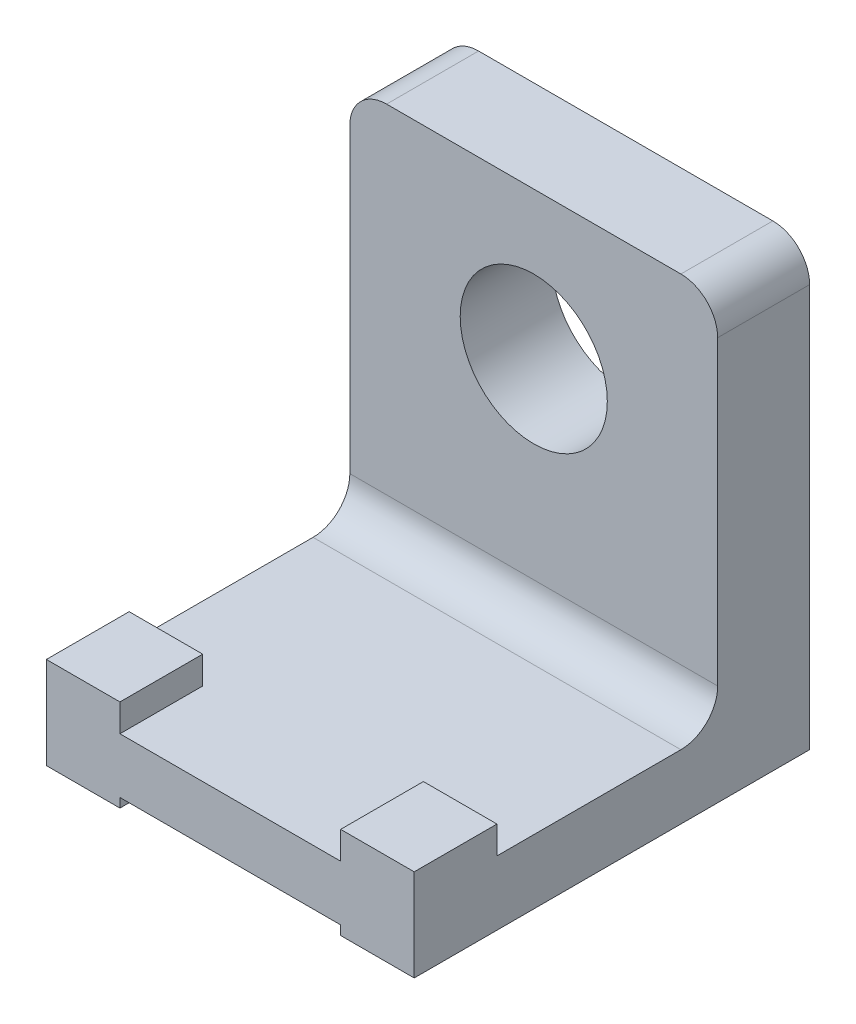
ISO-10303-21;
HEADER;
FILE_DESCRIPTION(('STEP AP214'),'2;1');
FILE_NAME('part.step','',(''),(''),'','','');
FILE_SCHEMA(('AUTOMOTIVE_DESIGN { 1 0 10303 214 1 1 1 1 }'));
ENDSEC;
DATA;
#1=APPLICATION_CONTEXT('core data for automotive mechanical design processes');
#2=APPLICATION_PROTOCOL_DEFINITION('international standard','automotive_design',2000,#1);
#3=PRODUCT_CONTEXT('',#1,'mechanical');
#4=PRODUCT('Part','Part','',(#3));
#5=PRODUCT_RELATED_PRODUCT_CATEGORY('part','',(#4));
#6=PRODUCT_DEFINITION_FORMATION('','',#4);
#7=PRODUCT_DEFINITION_CONTEXT('part definition',#1,'design');
#8=PRODUCT_DEFINITION('design','',#6,#7);
#9=PRODUCT_DEFINITION_SHAPE('','',#8);
#10=(LENGTH_UNIT() NAMED_UNIT(*) SI_UNIT(.MILLI.,.METRE.));
#11=(NAMED_UNIT(*) PLANE_ANGLE_UNIT() SI_UNIT($,.RADIAN.));
#12=(NAMED_UNIT(*) SI_UNIT($,.STERADIAN.) SOLID_ANGLE_UNIT());
#13=UNCERTAINTY_MEASURE_WITH_UNIT(LENGTH_MEASURE(1.E-05),#10,'distance_accuracy_value','');
#14=(GEOMETRIC_REPRESENTATION_CONTEXT(3) GLOBAL_UNCERTAINTY_ASSIGNED_CONTEXT((#13)) GLOBAL_UNIT_ASSIGNED_CONTEXT((#10,
#11,#12)) REPRESENTATION_CONTEXT('',''));
#15=CARTESIAN_POINT('',(0.,0.,0.));
#16=DIRECTION('',(0.,0.,1.));
#17=DIRECTION('',(1.,0.,0.));
#18=AXIS2_PLACEMENT_3D('',#15,#16,#17);
#19=CARTESIAN_POINT('',(-127.,0.,0.));
#20=DIRECTION('',(0.,-1.,0.));
#21=DIRECTION('',(0.,0.,-1.));
#22=AXIS2_PLACEMENT_3D('',#19,#20,#21);
#23=PLANE('',#22);
#24=DIRECTION('',(0.,0.,1.));
#25=VECTOR('',#24,1.);
#26=CARTESIAN_POINT('',(-25.4,0.,-184.216117149098));
#27=LINE('',#26,#25);
#28=CARTESIAN_POINT('',(-25.4,0.,-107.95));
#29=VERTEX_POINT('',#28);
#30=CARTESIAN_POINT('',(-25.4,0.,28.575));
#31=VERTEX_POINT('',#30);
#32=EDGE_CURVE('E207',#29,#31,#27,.T.);
#33=ORIENTED_EDGE('',*,*,#32,.F.);
#34=DIRECTION('',(1.,0.,0.));
#35=VECTOR('',#34,1.);
#36=CARTESIAN_POINT('',(-127.,0.,-107.95));
#37=LINE('',#36,#35);
#38=CARTESIAN_POINT('',(0.,0.,-107.95));
#39=VERTEX_POINT('',#38);
#40=EDGE_CURVE('E195',#29,#39,#37,.T.);
#41=ORIENTED_EDGE('',*,*,#40,.T.);
#42=DIRECTION('',(0.,0.,-1.));
#43=VECTOR('',#42,1.);
#44=CARTESIAN_POINT('',(0.,0.,0.));
#45=LINE('',#44,#43);
#46=CARTESIAN_POINT('',(0.,0.,28.575));
#47=VERTEX_POINT('',#46);
#48=EDGE_CURVE('E314',#47,#39,#45,.T.);
#49=ORIENTED_EDGE('',*,*,#48,.F.);
#50=DIRECTION('',(1.,0.,0.));
#51=VECTOR('',#50,1.);
#52=CARTESIAN_POINT('',(-127.,0.,28.575));
#53=LINE('',#52,#51);
#54=EDGE_CURVE('E252',#31,#47,#53,.T.);
#55=ORIENTED_EDGE('',*,*,#54,.F.);
#56=EDGE_LOOP('',(#33,#41,#49,#55));
#57=FACE_BOUND('',#56,.T.);
#58=ADVANCED_FACE('F37',(#57),#23,.T.);
#59=CARTESIAN_POINT('',(-127.,34.925,-63.5));
#60=DIRECTION('',(1.,0.,0.));
#61=DIRECTION('',(0.,0.,-1.));
#62=AXIS2_PLACEMENT_3D('',#59,#60,#61);
#63=CYLINDRICAL_SURFACE('',#62,12.7);
#64=CARTESIAN_POINT('',(0.,34.925,-63.5));
#65=DIRECTION('',(-1.,0.,0.));
#66=DIRECTION('',(0.,0.,1.));
#67=AXIS2_PLACEMENT_3D('',#64,#65,#66);
#68=CIRCLE('',#67,12.7);
#69=CARTESIAN_POINT('',(0.,34.925,-76.2));
#70=VERTEX_POINT('',#69);
#71=CARTESIAN_POINT('',(0.,22.225,-63.5));
#72=VERTEX_POINT('',#71);
#73=EDGE_CURVE('E296',#70,#72,#68,.T.);
#74=ORIENTED_EDGE('',*,*,#73,.F.);
#75=DIRECTION('',(1.,0.,0.));
#76=VECTOR('',#75,1.);
#77=CARTESIAN_POINT('',(-127.,34.925,-76.2));
#78=LINE('',#77,#76);
#79=CARTESIAN_POINT('',(-127.,34.925,-76.2));
#80=VERTEX_POINT('',#79);
#81=EDGE_CURVE('E11',#80,#70,#78,.T.);
#82=ORIENTED_EDGE('',*,*,#81,.F.);
#83=CARTESIAN_POINT('',(-127.,34.925,-63.5));
#84=DIRECTION('',(-1.,0.,0.));
#85=DIRECTION('',(0.,0.,1.));
#86=AXIS2_PLACEMENT_3D('',#83,#84,#85);
#87=CIRCLE('',#86,12.7);
#88=CARTESIAN_POINT('',(-127.,22.225,-63.5));
#89=VERTEX_POINT('',#88);
#90=EDGE_CURVE('E297',#80,#89,#87,.T.);
#91=ORIENTED_EDGE('',*,*,#90,.T.);
#92=DIRECTION('',(1.,0.,0.));
#93=VECTOR('',#92,1.);
#94=CARTESIAN_POINT('',(-127.,22.225,-63.5));
#95=LINE('',#94,#93);
#96=EDGE_CURVE('E41',#89,#72,#95,.T.);
#97=ORIENTED_EDGE('',*,*,#96,.T.);
#98=EDGE_LOOP('',(#74,#82,#91,#97));
#99=FACE_BOUND('',#98,.T.);
#100=ADVANCED_FACE('F39',(#99),#63,.F.);
#101=CARTESIAN_POINT('',(-127.,75.565,-76.2));
#102=DIRECTION('',(0.,0.,1.));
#103=DIRECTION('',(0.,-1.,0.));
#104=AXIS2_PLACEMENT_3D('',#101,#102,#103);
#105=PLANE('',#104);
#106=CARTESIAN_POINT('',(-63.5,100.965,-76.2));
#107=DIRECTION('',(0.,0.,1.));
#108=DIRECTION('',(0.,-1.,0.));
#109=AXIS2_PLACEMENT_3D('',#106,#107,#108);
#110=CIRCLE('',#109,25.4);
#111=CARTESIAN_POINT('',(-63.5,75.565,-76.2));
#112=VERTEX_POINT('',#111);
#113=EDGE_CURVE('E213',#112,#112,#110,.F.);
#114=ORIENTED_EDGE('',*,*,#113,.T.);
#115=EDGE_LOOP('',(#114));
#116=FACE_BOUND('',#115,.T.);
#117=DIRECTION('',(0.,-1.,0.));
#118=VECTOR('',#117,1.);
#119=CARTESIAN_POINT('',(0.,75.565,-76.2));
#120=LINE('',#119,#118);
#121=CARTESIAN_POINT('',(0.,139.065,-76.2));
#122=VERTEX_POINT('',#121);
#123=EDGE_CURVE('E300',#122,#70,#120,.T.);
#124=ORIENTED_EDGE('',*,*,#123,.F.);
#125=CARTESIAN_POINT('',(-12.7,139.065,-76.2));
#126=DIRECTION('',(0.,0.,1.));
#127=DIRECTION('',(0.,-1.,0.));
#128=AXIS2_PLACEMENT_3D('',#125,#126,#127);
#129=CIRCLE('',#128,12.7);
#130=CARTESIAN_POINT('',(-12.7000000000001,151.765,-76.2));
#131=VERTEX_POINT('',#130);
#132=EDGE_CURVE('E236',#122,#131,#129,.T.);
#133=ORIENTED_EDGE('',*,*,#132,.T.);
#134=DIRECTION('',(-1.,0.,0.));
#135=VECTOR('',#134,1.);
#136=CARTESIAN_POINT('',(-12.7000000000001,151.765,-76.2));
#137=LINE('',#136,#135);
#138=CARTESIAN_POINT('',(-114.3,151.765,-76.2));
#139=VERTEX_POINT('',#138);
#140=EDGE_CURVE('E233',#131,#139,#137,.T.);
#141=ORIENTED_EDGE('',*,*,#140,.T.);
#142=CARTESIAN_POINT('',(-114.3,139.065,-76.2));
#143=DIRECTION('',(0.,0.,1.));
#144=DIRECTION('',(0.,-1.,0.));
#145=AXIS2_PLACEMENT_3D('',#142,#143,#144);
#146=CIRCLE('',#145,12.7);
#147=CARTESIAN_POINT('',(-127.,139.065,-76.2));
#148=VERTEX_POINT('',#147);
#149=EDGE_CURVE('E229',#139,#148,#146,.T.);
#150=ORIENTED_EDGE('',*,*,#149,.T.);
#151=DIRECTION('',(0.,-1.,0.));
#152=VECTOR('',#151,1.);
#153=CARTESIAN_POINT('',(-127.,75.565,-76.2));
#154=LINE('',#153,#152);
#155=EDGE_CURVE('E307',#148,#80,#154,.T.);
#156=ORIENTED_EDGE('',*,*,#155,.T.);
#157=ORIENTED_EDGE('',*,*,#81,.T.);
#158=EDGE_LOOP('',(#124,#133,#141,#150,#156,#157));
#159=FACE_BOUND('',#158,.T.);
#160=ADVANCED_FACE('F332',(#116,#159),#105,.T.);
#161=CARTESIAN_POINT('',(-127.,0.,-107.95));
#162=DIRECTION('',(0.,0.,-1.));
#163=DIRECTION('',(-1.,0.,0.));
#164=AXIS2_PLACEMENT_3D('',#161,#162,#163);
#165=PLANE('',#164);
#166=DIRECTION('',(0.,1.,0.));
#167=VECTOR('',#166,1.);
#168=CARTESIAN_POINT('',(-25.4,3.175,-107.95));
#169=LINE('',#168,#167);
#170=CARTESIAN_POINT('',(-25.4,3.175,-107.95));
#171=VERTEX_POINT('',#170);
#172=EDGE_CURVE('E186',#29,#171,#169,.T.);
#173=ORIENTED_EDGE('',*,*,#172,.T.);
#174=DIRECTION('',(-1.,0.,0.));
#175=VECTOR('',#174,1.);
#176=CARTESIAN_POINT('',(-101.6,3.175,-107.95));
#177=LINE('',#176,#175);
#178=CARTESIAN_POINT('',(-101.6,3.175,-107.95));
#179=VERTEX_POINT('',#178);
#180=EDGE_CURVE('E174',#171,#179,#177,.T.);
#181=ORIENTED_EDGE('',*,*,#180,.T.);
#182=DIRECTION('',(0.,-1.,0.));
#183=VECTOR('',#182,1.);
#184=CARTESIAN_POINT('',(-101.6,0.,-107.95));
#185=LINE('',#184,#183);
#186=CARTESIAN_POINT('',(-101.6,0.,-107.95));
#187=VERTEX_POINT('',#186);
#188=EDGE_CURVE('E202',#179,#187,#185,.T.);
#189=ORIENTED_EDGE('',*,*,#188,.T.);
#190=CARTESIAN_POINT('',(-127.,0.,-107.95));
#191=VERTEX_POINT('',#190);
#192=EDGE_CURVE('E46',#191,#187,#37,.T.);
#193=ORIENTED_EDGE('',*,*,#192,.F.);
#194=DIRECTION('',(0.,1.,0.));
#195=VECTOR('',#194,1.);
#196=CARTESIAN_POINT('',(-127.,0.,-107.95));
#197=LINE('',#196,#195);
#198=CARTESIAN_POINT('',(-127.,139.065,-107.95));
#199=VERTEX_POINT('',#198);
#200=EDGE_CURVE('E305',#191,#199,#197,.T.);
#201=ORIENTED_EDGE('',*,*,#200,.T.);
#202=CARTESIAN_POINT('',(-114.3,139.065,-107.95));
#203=DIRECTION('',(0.,0.,1.));
#204=DIRECTION('',(1.,0.,0.));
#205=AXIS2_PLACEMENT_3D('',#202,#203,#204);
#206=CIRCLE('',#205,12.7);
#207=CARTESIAN_POINT('',(-114.3,151.765,-107.95));
#208=VERTEX_POINT('',#207);
#209=EDGE_CURVE('E217',#208,#199,#206,.T.);
#210=ORIENTED_EDGE('',*,*,#209,.F.);
#211=DIRECTION('',(-1.,0.,0.));
#212=VECTOR('',#211,1.);
#213=CARTESIAN_POINT('',(-12.7000000000001,151.765,-107.95));
#214=LINE('',#213,#212);
#215=CARTESIAN_POINT('',(-12.7000000000001,151.765,-107.95));
#216=VERTEX_POINT('',#215);
#217=EDGE_CURVE('E222',#216,#208,#214,.T.);
#218=ORIENTED_EDGE('',*,*,#217,.F.);
#219=CARTESIAN_POINT('',(-12.7,139.065,-107.95));
#220=DIRECTION('',(0.,0.,1.));
#221=DIRECTION('',(1.,0.,0.));
#222=AXIS2_PLACEMENT_3D('',#219,#220,#221);
#223=CIRCLE('',#222,12.7);
#224=CARTESIAN_POINT('',(0.,139.065,-107.95));
#225=VERTEX_POINT('',#224);
#226=EDGE_CURVE('E226',#225,#216,#223,.T.);
#227=ORIENTED_EDGE('',*,*,#226,.F.);
#228=DIRECTION('',(0.,1.,0.));
#229=VECTOR('',#228,1.);
#230=CARTESIAN_POINT('',(0.,0.,-107.95));
#231=LINE('',#230,#229);
#232=EDGE_CURVE('E317',#39,#225,#231,.T.);
#233=ORIENTED_EDGE('',*,*,#232,.F.);
#234=ORIENTED_EDGE('',*,*,#40,.F.);
#235=EDGE_LOOP('',(#173,#181,#189,#193,#201,#210,#218,#227,#233,#234));
#236=FACE_BOUND('',#235,.T.);
#237=CARTESIAN_POINT('',(-63.5,100.965,-107.95));
#238=DIRECTION('',(0.,0.,-1.));
#239=DIRECTION('',(-1.,0.,0.));
#240=AXIS2_PLACEMENT_3D('',#237,#238,#239);
#241=CIRCLE('',#240,25.4);
#242=CARTESIAN_POINT('',(-88.9,100.965,-107.95));
#243=VERTEX_POINT('',#242);
#244=EDGE_CURVE('E210',#243,#243,#241,.T.);
#245=ORIENTED_EDGE('',*,*,#244,.F.);
#246=EDGE_LOOP('',(#245));
#247=FACE_BOUND('',#246,.T.);
#248=ADVANCED_FACE('F192',(#236,#247),#165,.T.);
#249=DIRECTION('',(0.,0.,1.));
#250=VECTOR('',#249,1.);
#251=CARTESIAN_POINT('',(-101.6,0.,-184.216117149098));
#252=LINE('',#251,#250);
#253=CARTESIAN_POINT('',(-101.6,0.,28.575));
#254=VERTEX_POINT('',#253);
#255=EDGE_CURVE('E203',#187,#254,#252,.T.);
#256=ORIENTED_EDGE('',*,*,#255,.T.);
#257=CARTESIAN_POINT('',(-127.,0.,28.575));
#258=VERTEX_POINT('',#257);
#259=EDGE_CURVE('E253',#258,#254,#53,.T.);
#260=ORIENTED_EDGE('',*,*,#259,.F.);
#261=DIRECTION('',(0.,0.,-1.));
#262=VECTOR('',#261,1.);
#263=CARTESIAN_POINT('',(-127.,0.,0.));
#264=LINE('',#263,#262);
#265=EDGE_CURVE('E302',#258,#191,#264,.T.);
#266=ORIENTED_EDGE('',*,*,#265,.T.);
#267=ORIENTED_EDGE('',*,*,#192,.T.);
#268=EDGE_LOOP('',(#256,#260,#266,#267));
#269=FACE_BOUND('',#268,.T.);
#270=ADVANCED_FACE('F385',(#269),#23,.T.);
#271=CARTESIAN_POINT('',(-127.,22.225,-63.5));
#272=DIRECTION('',(0.,1.,0.));
#273=DIRECTION('',(0.,0.,1.));
#274=AXIS2_PLACEMENT_3D('',#271,#272,#273);
#275=PLANE('',#274);
#276=DIRECTION('',(0.,0.,1.));
#277=VECTOR('',#276,1.);
#278=CARTESIAN_POINT('',(0.,22.225,-63.5));
#279=LINE('',#278,#277);
#280=CARTESIAN_POINT('',(0.,22.225,0.));
#281=VERTEX_POINT('',#280);
#282=EDGE_CURVE('E311',#72,#281,#279,.T.);
#283=ORIENTED_EDGE('',*,*,#282,.F.);
#284=ORIENTED_EDGE('',*,*,#96,.F.);
#285=DIRECTION('',(0.,0.,1.));
#286=VECTOR('',#285,1.);
#287=CARTESIAN_POINT('',(-127.,22.225,-63.5));
#288=LINE('',#287,#286);
#289=CARTESIAN_POINT('',(-127.,22.225,0.));
#290=VERTEX_POINT('',#289);
#291=EDGE_CURVE('E299',#89,#290,#288,.T.);
#292=ORIENTED_EDGE('',*,*,#291,.T.);
#293=DIRECTION('',(1.,0.,0.));
#294=VECTOR('',#293,1.);
#295=CARTESIAN_POINT('',(-127.,22.225,0.));
#296=LINE('',#295,#294);
#297=CARTESIAN_POINT('',(-101.6,22.225,0.));
#298=VERTEX_POINT('',#297);
#299=EDGE_CURVE('E322',#290,#298,#296,.T.);
#300=ORIENTED_EDGE('',*,*,#299,.T.);
#301=DIRECTION('',(0.,0.,-1.));
#302=VECTOR('',#301,1.);
#303=CARTESIAN_POINT('',(-101.6,22.225,28.575));
#304=LINE('',#303,#302);
#305=CARTESIAN_POINT('',(-101.6,22.225,28.575));
#306=VERTEX_POINT('',#305);
#307=EDGE_CURVE('E282',#306,#298,#304,.T.);
#308=ORIENTED_EDGE('',*,*,#307,.F.);
#309=DIRECTION('',(-1.,0.,0.));
#310=VECTOR('',#309,1.);
#311=CARTESIAN_POINT('',(-25.4,22.225,28.575));
#312=LINE('',#311,#310);
#313=CARTESIAN_POINT('',(-25.4,22.225,28.575));
#314=VERTEX_POINT('',#313);
#315=EDGE_CURVE('E262',#314,#306,#312,.T.);
#316=ORIENTED_EDGE('',*,*,#315,.F.);
#317=DIRECTION('',(0.,0.,-1.));
#318=VECTOR('',#317,1.);
#319=CARTESIAN_POINT('',(-25.4,22.225,28.575));
#320=LINE('',#319,#318);
#321=CARTESIAN_POINT('',(-25.4,22.225,0.));
#322=VERTEX_POINT('',#321);
#323=EDGE_CURVE('E284',#314,#322,#320,.T.);
#324=ORIENTED_EDGE('',*,*,#323,.T.);
#325=EDGE_CURVE('E324',#322,#281,#296,.T.);
#326=ORIENTED_EDGE('',*,*,#325,.T.);
#327=EDGE_LOOP('',(#283,#284,#292,#300,#308,#316,#324,#326));
#328=FACE_BOUND('',#327,.T.);
#329=ADVANCED_FACE('F327',(#328),#275,.T.);
#330=CARTESIAN_POINT('',(-127.,34.925,-63.5));
#331=DIRECTION('',(-1.,0.,0.));
#332=DIRECTION('',(0.,0.,1.));
#333=AXIS2_PLACEMENT_3D('',#330,#331,#332);
#334=PLANE('',#333);
#335=ORIENTED_EDGE('',*,*,#90,.F.);
#336=ORIENTED_EDGE('',*,*,#155,.F.);
#337=DIRECTION('',(0.,0.,-1.));
#338=VECTOR('',#337,1.);
#339=CARTESIAN_POINT('',(-127.,139.065,71.9061781290706));
#340=LINE('',#339,#338);
#341=EDGE_CURVE('E220',#148,#199,#340,.T.);
#342=ORIENTED_EDGE('',*,*,#341,.T.);
#343=ORIENTED_EDGE('',*,*,#200,.F.);
#344=ORIENTED_EDGE('',*,*,#265,.F.);
#345=DIRECTION('',(0.,-1.,0.));
#346=VECTOR('',#345,1.);
#347=CARTESIAN_POINT('',(-127.,0.,28.575));
#348=LINE('',#347,#346);
#349=CARTESIAN_POINT('',(-127.,31.75,28.575));
#350=VERTEX_POINT('',#349);
#351=EDGE_CURVE('E248',#350,#258,#348,.T.);
#352=ORIENTED_EDGE('',*,*,#351,.F.);
#353=DIRECTION('',(0.,0.,-1.));
#354=VECTOR('',#353,1.);
#355=CARTESIAN_POINT('',(-127.,31.75,28.575));
#356=LINE('',#355,#354);
#357=CARTESIAN_POINT('',(-127.,31.75,0.));
#358=VERTEX_POINT('',#357);
#359=EDGE_CURVE('E293',#350,#358,#356,.T.);
#360=ORIENTED_EDGE('',*,*,#359,.T.);
#361=DIRECTION('',(0.,-1.,0.));
#362=VECTOR('',#361,1.);
#363=CARTESIAN_POINT('',(-127.,0.,0.));
#364=LINE('',#363,#362);
#365=EDGE_CURVE('E269',#358,#290,#364,.T.);
#366=ORIENTED_EDGE('',*,*,#365,.T.);
#367=ORIENTED_EDGE('',*,*,#291,.F.);
#368=EDGE_LOOP('',(#335,#336,#342,#343,#344,#352,#360,#366,#367));
#369=FACE_BOUND('',#368,.T.);
#370=ADVANCED_FACE('F347',(#369),#334,.T.);
#371=CARTESIAN_POINT('',(0.,34.925,-63.5));
#372=DIRECTION('',(-1.,0.,0.));
#373=DIRECTION('',(0.,0.,1.));
#374=AXIS2_PLACEMENT_3D('',#371,#372,#373);
#375=PLANE('',#374);
#376=ORIENTED_EDGE('',*,*,#73,.T.);
#377=ORIENTED_EDGE('',*,*,#282,.T.);
#378=DIRECTION('',(0.,1.,0.));
#379=VECTOR('',#378,1.);
#380=CARTESIAN_POINT('',(0.,0.,0.));
#381=LINE('',#380,#379);
#382=CARTESIAN_POINT('',(0.,31.75,0.));
#383=VERTEX_POINT('',#382);
#384=EDGE_CURVE('E272',#281,#383,#381,.T.);
#385=ORIENTED_EDGE('',*,*,#384,.T.);
#386=DIRECTION('',(0.,0.,-1.));
#387=VECTOR('',#386,1.);
#388=CARTESIAN_POINT('',(0.,31.75,28.575));
#389=LINE('',#388,#387);
#390=CARTESIAN_POINT('',(0.,31.75,28.575));
#391=VERTEX_POINT('',#390);
#392=EDGE_CURVE('E290',#391,#383,#389,.T.);
#393=ORIENTED_EDGE('',*,*,#392,.F.);
#394=DIRECTION('',(0.,1.,0.));
#395=VECTOR('',#394,1.);
#396=CARTESIAN_POINT('',(0.,0.,28.575));
#397=LINE('',#396,#395);
#398=EDGE_CURVE('E256',#47,#391,#397,.T.);
#399=ORIENTED_EDGE('',*,*,#398,.F.);
#400=ORIENTED_EDGE('',*,*,#48,.T.);
#401=ORIENTED_EDGE('',*,*,#232,.T.);
#402=DIRECTION('',(0.,0.,-1.));
#403=VECTOR('',#402,1.);
#404=CARTESIAN_POINT('',(0.,139.065,71.9061781290706));
#405=LINE('',#404,#403);
#406=EDGE_CURVE('E216',#122,#225,#405,.T.);
#407=ORIENTED_EDGE('',*,*,#406,.F.);
#408=ORIENTED_EDGE('',*,*,#123,.T.);
#409=EDGE_LOOP('',(#376,#377,#385,#393,#399,#400,#401,#407,#408));
#410=FACE_BOUND('',#409,.T.);
#411=ADVANCED_FACE('F329',(#410),#375,.F.);
#412=CARTESIAN_POINT('',(0.,0.,0.));
#413=DIRECTION('',(0.,0.,-1.));
#414=DIRECTION('',(-1.,0.,0.));
#415=AXIS2_PLACEMENT_3D('',#412,#413,#414);
#416=PLANE('',#415);
#417=ORIENTED_EDGE('',*,*,#299,.F.);
#418=ORIENTED_EDGE('',*,*,#365,.F.);
#419=DIRECTION('',(-1.,0.,0.));
#420=VECTOR('',#419,1.);
#421=CARTESIAN_POINT('',(-127.,31.75,0.));
#422=LINE('',#421,#420);
#423=CARTESIAN_POINT('',(-101.6,31.75,0.));
#424=VERTEX_POINT('',#423);
#425=EDGE_CURVE('E232',#424,#358,#422,.T.);
#426=ORIENTED_EDGE('',*,*,#425,.F.);
#427=DIRECTION('',(0.,1.,0.));
#428=VECTOR('',#427,1.);
#429=CARTESIAN_POINT('',(-101.6,31.75,0.));
#430=LINE('',#429,#428);
#431=EDGE_CURVE('E249',#298,#424,#430,.T.);
#432=ORIENTED_EDGE('',*,*,#431,.F.);
#433=EDGE_LOOP('',(#417,#418,#426,#432));
#434=FACE_BOUND('',#433,.T.);
#435=ADVANCED_FACE('F351',(#434),#416,.T.);
#436=ORIENTED_EDGE('',*,*,#325,.F.);
#437=DIRECTION('',(0.,-1.,0.));
#438=VECTOR('',#437,1.);
#439=CARTESIAN_POINT('',(-25.4,31.75,0.));
#440=LINE('',#439,#438);
#441=CARTESIAN_POINT('',(-25.4,31.75,0.));
#442=VERTEX_POINT('',#441);
#443=EDGE_CURVE('E276',#442,#322,#440,.T.);
#444=ORIENTED_EDGE('',*,*,#443,.F.);
#445=DIRECTION('',(-1.,0.,0.));
#446=VECTOR('',#445,1.);
#447=CARTESIAN_POINT('',(0.,31.75,0.));
#448=LINE('',#447,#446);
#449=EDGE_CURVE('E274',#383,#442,#448,.T.);
#450=ORIENTED_EDGE('',*,*,#449,.F.);
#451=ORIENTED_EDGE('',*,*,#384,.F.);
#452=EDGE_LOOP('',(#436,#444,#450,#451));
#453=FACE_BOUND('',#452,.T.);
#454=ADVANCED_FACE('F372',(#453),#416,.T.);
#455=CARTESIAN_POINT('',(-127.,31.75,28.575));
#456=DIRECTION('',(0.,-1.,0.));
#457=DIRECTION('',(0.,0.,-1.));
#458=AXIS2_PLACEMENT_3D('',#455,#456,#457);
#459=PLANE('',#458);
#460=ORIENTED_EDGE('',*,*,#425,.T.);
#461=ORIENTED_EDGE('',*,*,#359,.F.);
#462=DIRECTION('',(-1.,0.,0.));
#463=VECTOR('',#462,1.);
#464=CARTESIAN_POINT('',(-127.,31.75,28.575));
#465=LINE('',#464,#463);
#466=CARTESIAN_POINT('',(-101.6,31.75,28.575));
#467=VERTEX_POINT('',#466);
#468=EDGE_CURVE('E245',#467,#350,#465,.T.);
#469=ORIENTED_EDGE('',*,*,#468,.F.);
#470=DIRECTION('',(0.,0.,-1.));
#471=VECTOR('',#470,1.);
#472=CARTESIAN_POINT('',(-101.6,31.75,28.575));
#473=LINE('',#472,#471);
#474=EDGE_CURVE('E266',#467,#424,#473,.T.);
#475=ORIENTED_EDGE('',*,*,#474,.T.);
#476=EDGE_LOOP('',(#460,#461,#469,#475));
#477=FACE_BOUND('',#476,.T.);
#478=ADVANCED_FACE('F359',(#477),#459,.F.);
#479=CARTESIAN_POINT('',(0.,31.75,28.575));
#480=DIRECTION('',(0.,-1.,0.));
#481=DIRECTION('',(0.,0.,-1.));
#482=AXIS2_PLACEMENT_3D('',#479,#480,#481);
#483=PLANE('',#482);
#484=ORIENTED_EDGE('',*,*,#449,.T.);
#485=DIRECTION('',(0.,0.,-1.));
#486=VECTOR('',#485,1.);
#487=CARTESIAN_POINT('',(-25.4,31.75,28.575));
#488=LINE('',#487,#486);
#489=CARTESIAN_POINT('',(-25.4,31.75,28.575));
#490=VERTEX_POINT('',#489);
#491=EDGE_CURVE('E287',#490,#442,#488,.T.);
#492=ORIENTED_EDGE('',*,*,#491,.F.);
#493=DIRECTION('',(-1.,0.,0.));
#494=VECTOR('',#493,1.);
#495=CARTESIAN_POINT('',(0.,31.75,28.575));
#496=LINE('',#495,#494);
#497=EDGE_CURVE('E258',#391,#490,#496,.T.);
#498=ORIENTED_EDGE('',*,*,#497,.F.);
#499=ORIENTED_EDGE('',*,*,#392,.T.);
#500=EDGE_LOOP('',(#484,#492,#498,#499));
#501=FACE_BOUND('',#500,.T.);
#502=ADVANCED_FACE('F377',(#501),#483,.F.);
#503=CARTESIAN_POINT('',(-25.4,31.75,28.575));
#504=DIRECTION('',(1.,0.,0.));
#505=DIRECTION('',(0.,0.,-1.));
#506=AXIS2_PLACEMENT_3D('',#503,#504,#505);
#507=PLANE('',#506);
#508=ORIENTED_EDGE('',*,*,#443,.T.);
#509=ORIENTED_EDGE('',*,*,#323,.F.);
#510=DIRECTION('',(0.,-1.,0.));
#511=VECTOR('',#510,1.);
#512=CARTESIAN_POINT('',(-25.4,31.75,28.575));
#513=LINE('',#512,#511);
#514=EDGE_CURVE('E260',#490,#314,#513,.T.);
#515=ORIENTED_EDGE('',*,*,#514,.F.);
#516=ORIENTED_EDGE('',*,*,#491,.T.);
#517=EDGE_LOOP('',(#508,#509,#515,#516));
#518=FACE_BOUND('',#517,.T.);
#519=ADVANCED_FACE('F367',(#518),#507,.F.);
#520=CARTESIAN_POINT('',(-101.6,31.75,28.575));
#521=DIRECTION('',(-1.,0.,0.));
#522=DIRECTION('',(0.,0.,1.));
#523=AXIS2_PLACEMENT_3D('',#520,#521,#522);
#524=PLANE('',#523);
#525=ORIENTED_EDGE('',*,*,#431,.T.);
#526=ORIENTED_EDGE('',*,*,#474,.F.);
#527=DIRECTION('',(0.,1.,0.));
#528=VECTOR('',#527,1.);
#529=CARTESIAN_POINT('',(-101.6,31.75,28.575));
#530=LINE('',#529,#528);
#531=EDGE_CURVE('E264',#306,#467,#530,.T.);
#532=ORIENTED_EDGE('',*,*,#531,.F.);
#533=ORIENTED_EDGE('',*,*,#307,.T.);
#534=EDGE_LOOP('',(#525,#526,#532,#533));
#535=FACE_BOUND('',#534,.T.);
#536=ADVANCED_FACE('F355',(#535),#524,.F.);
#537=CARTESIAN_POINT('',(0.,0.,28.575));
#538=DIRECTION('',(0.,0.,-1.));
#539=DIRECTION('',(-1.,0.,0.));
#540=AXIS2_PLACEMENT_3D('',#537,#538,#539);
#541=PLANE('',#540);
#542=DIRECTION('',(-1.,0.,0.));
#543=VECTOR('',#542,1.);
#544=CARTESIAN_POINT('',(-101.6,3.175,28.575));
#545=LINE('',#544,#543);
#546=CARTESIAN_POINT('',(-25.4,3.175,28.575));
#547=VERTEX_POINT('',#546);
#548=CARTESIAN_POINT('',(-101.6,3.175,28.575));
#549=VERTEX_POINT('',#548);
#550=EDGE_CURVE('E54',#547,#549,#545,.T.);
#551=ORIENTED_EDGE('',*,*,#550,.F.);
#552=DIRECTION('',(0.,1.,0.));
#553=VECTOR('',#552,1.);
#554=CARTESIAN_POINT('',(-25.4,3.175,28.575));
#555=LINE('',#554,#553);
#556=EDGE_CURVE('E189',#31,#547,#555,.T.);
#557=ORIENTED_EDGE('',*,*,#556,.F.);
#558=ORIENTED_EDGE('',*,*,#54,.T.);
#559=ORIENTED_EDGE('',*,*,#398,.T.);
#560=ORIENTED_EDGE('',*,*,#497,.T.);
#561=ORIENTED_EDGE('',*,*,#514,.T.);
#562=ORIENTED_EDGE('',*,*,#315,.T.);
#563=ORIENTED_EDGE('',*,*,#531,.T.);
#564=ORIENTED_EDGE('',*,*,#468,.T.);
#565=ORIENTED_EDGE('',*,*,#351,.T.);
#566=ORIENTED_EDGE('',*,*,#259,.T.);
#567=DIRECTION('',(0.,-1.,0.));
#568=VECTOR('',#567,1.);
#569=CARTESIAN_POINT('',(-101.6,0.,28.575));
#570=LINE('',#569,#568);
#571=EDGE_CURVE('E196',#549,#254,#570,.T.);
#572=ORIENTED_EDGE('',*,*,#571,.F.);
#573=EDGE_LOOP('',(#551,#557,#558,#559,#560,#561,#562,#563,#564,#565,#566,#572));
#574=FACE_BOUND('',#573,.T.);
#575=ADVANCED_FACE('F361',(#574),#541,.F.);
#576=CARTESIAN_POINT('',(-12.7,139.065,71.9061781290706));
#577=DIRECTION('',(0.,0.,-1.));
#578=DIRECTION('',(-1.,0.,0.));
#579=AXIS2_PLACEMENT_3D('',#576,#577,#578);
#580=CYLINDRICAL_SURFACE('',#579,12.7);
#581=ORIENTED_EDGE('',*,*,#132,.F.);
#582=ORIENTED_EDGE('',*,*,#406,.T.);
#583=ORIENTED_EDGE('',*,*,#226,.T.);
#584=DIRECTION('',(0.,0.,-1.));
#585=VECTOR('',#584,1.);
#586=CARTESIAN_POINT('',(-12.7000000000001,151.765,71.9061781290706));
#587=LINE('',#586,#585);
#588=EDGE_CURVE('E225',#131,#216,#587,.T.);
#589=ORIENTED_EDGE('',*,*,#588,.F.);
#590=EDGE_LOOP('',(#581,#582,#583,#589));
#591=FACE_BOUND('',#590,.T.);
#592=ADVANCED_FACE('F335',(#591),#580,.T.);
#593=CARTESIAN_POINT('',(-12.7000000000001,151.765,71.9061781290706));
#594=DIRECTION('',(0.,-1.,0.));
#595=DIRECTION('',(0.,0.,-1.));
#596=AXIS2_PLACEMENT_3D('',#593,#594,#595);
#597=PLANE('',#596);
#598=ORIENTED_EDGE('',*,*,#140,.F.);
#599=ORIENTED_EDGE('',*,*,#588,.T.);
#600=ORIENTED_EDGE('',*,*,#217,.T.);
#601=DIRECTION('',(0.,0.,-1.));
#602=VECTOR('',#601,1.);
#603=CARTESIAN_POINT('',(-114.3,151.765,71.9061781290706));
#604=LINE('',#603,#602);
#605=EDGE_CURVE('E221',#139,#208,#604,.T.);
#606=ORIENTED_EDGE('',*,*,#605,.F.);
#607=EDGE_LOOP('',(#598,#599,#600,#606));
#608=FACE_BOUND('',#607,.T.);
#609=ADVANCED_FACE('F339',(#608),#597,.F.);
#610=CARTESIAN_POINT('',(-114.3,139.065,71.9061781290706));
#611=DIRECTION('',(0.,0.,-1.));
#612=DIRECTION('',(-1.,0.,0.));
#613=AXIS2_PLACEMENT_3D('',#610,#611,#612);
#614=CYLINDRICAL_SURFACE('',#613,12.7);
#615=ORIENTED_EDGE('',*,*,#149,.F.);
#616=ORIENTED_EDGE('',*,*,#605,.T.);
#617=ORIENTED_EDGE('',*,*,#209,.T.);
#618=ORIENTED_EDGE('',*,*,#341,.F.);
#619=EDGE_LOOP('',(#615,#616,#617,#618));
#620=FACE_BOUND('',#619,.T.);
#621=ADVANCED_FACE('F345',(#620),#614,.T.);
#622=CARTESIAN_POINT('',(-63.5,100.965,-4.35795103144673));
#623=DIRECTION('',(0.,0.,-1.));
#624=DIRECTION('',(-1.,0.,0.));
#625=AXIS2_PLACEMENT_3D('',#622,#623,#624);
#626=CYLINDRICAL_SURFACE('',#625,25.4);
#627=ORIENTED_EDGE('',*,*,#244,.T.);
#628=EDGE_LOOP('',(#627));
#629=FACE_BOUND('',#628,.T.);
#630=ORIENTED_EDGE('',*,*,#113,.F.);
#631=EDGE_LOOP('',(#630));
#632=FACE_BOUND('',#631,.T.);
#633=ADVANCED_FACE('F427',(#629,#632),#626,.F.);
#634=CARTESIAN_POINT('',(-25.4,3.175,-184.216117149098));
#635=DIRECTION('',(1.,0.,0.));
#636=DIRECTION('',(0.,0.,-1.));
#637=AXIS2_PLACEMENT_3D('',#634,#635,#636);
#638=PLANE('',#637);
#639=ORIENTED_EDGE('',*,*,#32,.T.);
#640=ORIENTED_EDGE('',*,*,#556,.T.);
#641=DIRECTION('',(0.,0.,1.));
#642=VECTOR('',#641,1.);
#643=CARTESIAN_POINT('',(-25.4,3.175,-184.216117149098));
#644=LINE('',#643,#642);
#645=EDGE_CURVE('E177',#171,#547,#644,.T.);
#646=ORIENTED_EDGE('',*,*,#645,.F.);
#647=ORIENTED_EDGE('',*,*,#172,.F.);
#648=EDGE_LOOP('',(#639,#640,#646,#647));
#649=FACE_BOUND('',#648,.T.);
#650=ADVANCED_FACE('F185',(#649),#638,.F.);
#651=CARTESIAN_POINT('',(-101.6,3.175,-184.216117149098));
#652=DIRECTION('',(0.,1.,0.));
#653=DIRECTION('',(0.,0.,1.));
#654=AXIS2_PLACEMENT_3D('',#651,#652,#653);
#655=PLANE('',#654);
#656=ORIENTED_EDGE('',*,*,#645,.T.);
#657=ORIENTED_EDGE('',*,*,#550,.T.);
#658=DIRECTION('',(0.,0.,1.));
#659=VECTOR('',#658,1.);
#660=CARTESIAN_POINT('',(-101.6,3.175,-184.216117149098));
#661=LINE('',#660,#659);
#662=EDGE_CURVE('E179',#179,#549,#661,.T.);
#663=ORIENTED_EDGE('',*,*,#662,.F.);
#664=ORIENTED_EDGE('',*,*,#180,.F.);
#665=EDGE_LOOP('',(#656,#657,#663,#664));
#666=FACE_BOUND('',#665,.T.);
#667=ADVANCED_FACE('F176',(#666),#655,.F.);
#668=CARTESIAN_POINT('',(-101.6,0.,-184.216117149098));
#669=DIRECTION('',(-1.,0.,0.));
#670=DIRECTION('',(0.,0.,1.));
#671=AXIS2_PLACEMENT_3D('',#668,#669,#670);
#672=PLANE('',#671);
#673=ORIENTED_EDGE('',*,*,#662,.T.);
#674=ORIENTED_EDGE('',*,*,#571,.T.);
#675=ORIENTED_EDGE('',*,*,#255,.F.);
#676=ORIENTED_EDGE('',*,*,#188,.F.);
#677=EDGE_LOOP('',(#673,#674,#675,#676));
#678=FACE_BOUND('',#677,.T.);
#679=ADVANCED_FACE('F383',(#678),#672,.F.);
#680=CLOSED_SHELL('',(#58,#100,#160,#248,#270,#329,#370,#411,#435,#454,#478,#502,#519,#536,#575,
#592,#609,#621,#633,#650,#667,#679));
#681=MANIFOLD_SOLID_BREP('B2',#680);
#682=ADVANCED_BREP_SHAPE_REPRESENTATION('',(#18,#681),#14);
#683=SHAPE_DEFINITION_REPRESENTATION(#9,#682);
ENDSEC;
END-ISO-10303-21;
